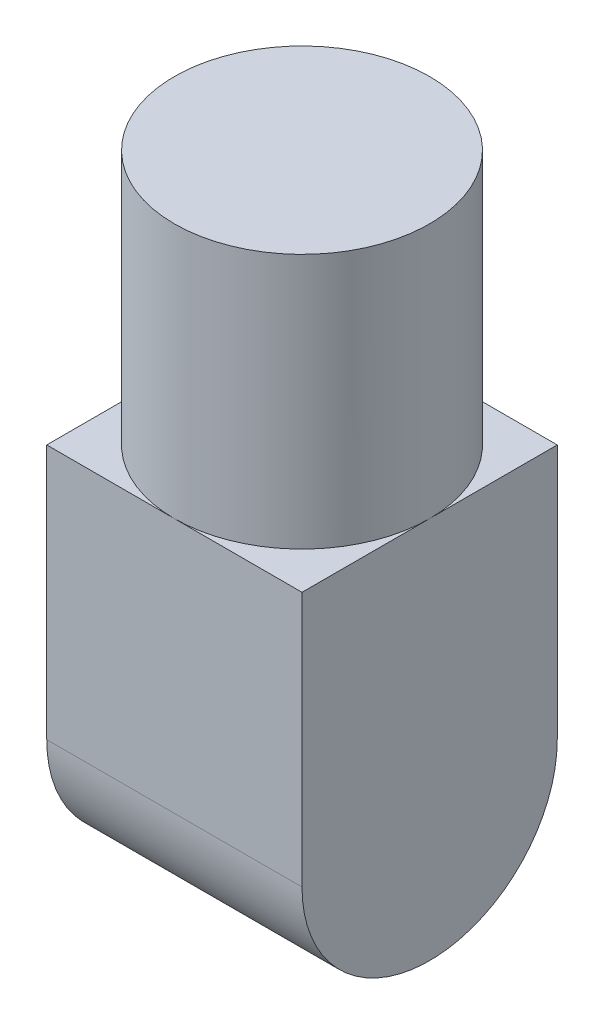
ISO-10303-21;
HEADER;
FILE_DESCRIPTION(('STEP AP214'),'2;1');
FILE_NAME('part.step','',(''),(''),'','','');
FILE_SCHEMA(('AUTOMOTIVE_DESIGN { 1 0 10303 214 1 1 1 1 }'));
ENDSEC;
DATA;
#1=APPLICATION_CONTEXT('core data for automotive mechanical design processes');
#2=APPLICATION_PROTOCOL_DEFINITION('international standard','automotive_design',2000,#1);
#3=PRODUCT_CONTEXT('',#1,'mechanical');
#4=PRODUCT('Part','Part','',(#3));
#5=PRODUCT_RELATED_PRODUCT_CATEGORY('part','',(#4));
#6=PRODUCT_DEFINITION_FORMATION('','',#4);
#7=PRODUCT_DEFINITION_CONTEXT('part definition',#1,'design');
#8=PRODUCT_DEFINITION('design','',#6,#7);
#9=PRODUCT_DEFINITION_SHAPE('','',#8);
#10=(LENGTH_UNIT() NAMED_UNIT(*) SI_UNIT(.MILLI.,.METRE.));
#11=(NAMED_UNIT(*) PLANE_ANGLE_UNIT() SI_UNIT($,.RADIAN.));
#12=(NAMED_UNIT(*) SI_UNIT($,.STERADIAN.) SOLID_ANGLE_UNIT());
#13=UNCERTAINTY_MEASURE_WITH_UNIT(LENGTH_MEASURE(1.E-05),#10,'distance_accuracy_value','');
#14=(GEOMETRIC_REPRESENTATION_CONTEXT(3) GLOBAL_UNCERTAINTY_ASSIGNED_CONTEXT((#13)) GLOBAL_UNIT_ASSIGNED_CONTEXT((#10,
#11,#12)) REPRESENTATION_CONTEXT('',''));
#15=CARTESIAN_POINT('',(0.,0.,0.));
#16=DIRECTION('',(0.,0.,1.));
#17=DIRECTION('',(1.,0.,0.));
#18=AXIS2_PLACEMENT_3D('',#15,#16,#17);
#19=CARTESIAN_POINT('',(80.,40.,40.));
#20=DIRECTION('',(0.,-1.,0.));
#21=DIRECTION('',(0.,0.,-1.));
#22=AXIS2_PLACEMENT_3D('',#19,#20,#21);
#23=PLANE('',#22);
#24=CARTESIAN_POINT('',(40.,40.,0.));
#25=DIRECTION('',(0.,1.,0.));
#26=DIRECTION('',(0.,0.,1.));
#27=AXIS2_PLACEMENT_3D('',#24,#25,#26);
#28=CIRCLE('',#27,40.);
#29=CARTESIAN_POINT('',(40.,40.,40.));
#30=VERTEX_POINT('',#29);
#31=CARTESIAN_POINT('',(80.,40.,0.));
#32=VERTEX_POINT('',#31);
#33=EDGE_CURVE('E48',#30,#32,#28,.T.);
#34=ORIENTED_EDGE('',*,*,#33,.F.);
#35=DIRECTION('',(-1.,0.,0.));
#36=VECTOR('',#35,1.);
#37=CARTESIAN_POINT('',(80.,40.,40.));
#38=LINE('',#37,#36);
#39=CARTESIAN_POINT('',(80.,40.,40.));
#40=VERTEX_POINT('',#39);
#41=EDGE_CURVE('E92',#40,#30,#38,.T.);
#42=ORIENTED_EDGE('',*,*,#41,.F.);
#43=DIRECTION('',(0.,0.,1.));
#44=VECTOR('',#43,1.);
#45=CARTESIAN_POINT('',(80.,40.,40.));
#46=LINE('',#45,#44);
#47=EDGE_CURVE('E111',#32,#40,#46,.T.);
#48=ORIENTED_EDGE('',*,*,#47,.F.);
#49=EDGE_LOOP('',(#34,#42,#48));
#50=FACE_BOUND('',#49,.T.);
#51=ADVANCED_FACE('F37',(#50),#23,.F.);
#52=CARTESIAN_POINT('',(40.,40.,-40.));
#53=VERTEX_POINT('',#52);
#54=EDGE_CURVE('E11',#32,#53,#28,.T.);
#55=ORIENTED_EDGE('',*,*,#54,.F.);
#56=CARTESIAN_POINT('',(80.,40.,-40.));
#57=VERTEX_POINT('',#56);
#58=EDGE_CURVE('E122',#57,#32,#46,.T.);
#59=ORIENTED_EDGE('',*,*,#58,.F.);
#60=DIRECTION('',(-1.,0.,0.));
#61=VECTOR('',#60,1.);
#62=CARTESIAN_POINT('',(80.,40.,-40.));
#63=LINE('',#62,#61);
#64=EDGE_CURVE('E41',#57,#53,#63,.T.);
#65=ORIENTED_EDGE('',*,*,#64,.T.);
#66=EDGE_LOOP('',(#55,#59,#65));
#67=FACE_BOUND('',#66,.T.);
#68=ADVANCED_FACE('F153',(#67),#23,.F.);
#69=CARTESIAN_POINT('',(0.,40.,0.));
#70=VERTEX_POINT('',#69);
#71=EDGE_CURVE('E46',#53,#70,#28,.T.);
#72=ORIENTED_EDGE('',*,*,#71,.F.);
#73=CARTESIAN_POINT('',(0.,40.,-40.));
#74=VERTEX_POINT('',#73);
#75=EDGE_CURVE('E101',#53,#74,#63,.T.);
#76=ORIENTED_EDGE('',*,*,#75,.T.);
#77=DIRECTION('',(0.,0.,1.));
#78=VECTOR('',#77,1.);
#79=CARTESIAN_POINT('',(0.,40.,40.));
#80=LINE('',#79,#78);
#81=EDGE_CURVE('E131',#74,#70,#80,.T.);
#82=ORIENTED_EDGE('',*,*,#81,.T.);
#83=EDGE_LOOP('',(#72,#76,#82));
#84=FACE_BOUND('',#83,.T.);
#85=ADVANCED_FACE('F155',(#84),#23,.F.);
#86=CARTESIAN_POINT('',(80.,-40.,-40.));
#87=DIRECTION('',(0.,0.,1.));
#88=DIRECTION('',(1.,0.,0.));
#89=AXIS2_PLACEMENT_3D('',#86,#87,#88);
#90=PLANE('',#89);
#91=DIRECTION('',(0.,1.,0.));
#92=VECTOR('',#91,1.);
#93=CARTESIAN_POINT('',(0.,-40.,-40.));
#94=LINE('',#93,#92);
#95=CARTESIAN_POINT('',(0.,-40.,-40.));
#96=VERTEX_POINT('',#95);
#97=EDGE_CURVE('E128',#96,#74,#94,.T.);
#98=ORIENTED_EDGE('',*,*,#97,.T.);
#99=ORIENTED_EDGE('',*,*,#75,.F.);
#100=ORIENTED_EDGE('',*,*,#64,.F.);
#101=DIRECTION('',(0.,1.,0.));
#102=VECTOR('',#101,1.);
#103=CARTESIAN_POINT('',(80.,-40.,-40.));
#104=LINE('',#103,#102);
#105=CARTESIAN_POINT('',(80.,-40.,-40.));
#106=VERTEX_POINT('',#105);
#107=EDGE_CURVE('E118',#106,#57,#104,.T.);
#108=ORIENTED_EDGE('',*,*,#107,.F.);
#109=DIRECTION('',(-1.,0.,0.));
#110=VECTOR('',#109,1.);
#111=CARTESIAN_POINT('',(80.,-40.,-40.));
#112=LINE('',#111,#110);
#113=EDGE_CURVE('E127',#106,#96,#112,.T.);
#114=ORIENTED_EDGE('',*,*,#113,.T.);
#115=EDGE_LOOP('',(#98,#99,#100,#108,#114));
#116=FACE_BOUND('',#115,.T.);
#117=ADVANCED_FACE('F39',(#116),#90,.F.);
#118=EDGE_CURVE('E105',#70,#30,#28,.T.);
#119=ORIENTED_EDGE('',*,*,#118,.F.);
#120=CARTESIAN_POINT('',(0.,40.,40.));
#121=VERTEX_POINT('',#120);
#122=EDGE_CURVE('E107',#70,#121,#80,.T.);
#123=ORIENTED_EDGE('',*,*,#122,.T.);
#124=EDGE_CURVE('E95',#30,#121,#38,.T.);
#125=ORIENTED_EDGE('',*,*,#124,.F.);
#126=EDGE_LOOP('',(#119,#123,#125));
#127=FACE_BOUND('',#126,.T.);
#128=ADVANCED_FACE('F103',(#127),#23,.F.);
#129=CARTESIAN_POINT('',(80.,-40.,40.));
#130=DIRECTION('',(0.,0.,-1.));
#131=DIRECTION('',(-1.,0.,0.));
#132=AXIS2_PLACEMENT_3D('',#129,#130,#131);
#133=PLANE('',#132);
#134=DIRECTION('',(0.,-1.,0.));
#135=VECTOR('',#134,1.);
#136=CARTESIAN_POINT('',(0.,-40.,40.));
#137=LINE('',#136,#135);
#138=CARTESIAN_POINT('',(0.,-40.,40.));
#139=VERTEX_POINT('',#138);
#140=EDGE_CURVE('E133',#121,#139,#137,.T.);
#141=ORIENTED_EDGE('',*,*,#140,.T.);
#142=DIRECTION('',(-1.,0.,0.));
#143=VECTOR('',#142,1.);
#144=CARTESIAN_POINT('',(80.,-40.,40.));
#145=LINE('',#144,#143);
#146=CARTESIAN_POINT('',(80.,-40.,40.));
#147=VERTEX_POINT('',#146);
#148=EDGE_CURVE('E109',#147,#139,#145,.T.);
#149=ORIENTED_EDGE('',*,*,#148,.F.);
#150=DIRECTION('',(0.,-1.,0.));
#151=VECTOR('',#150,1.);
#152=CARTESIAN_POINT('',(80.,-40.,40.));
#153=LINE('',#152,#151);
#154=EDGE_CURVE('E98',#40,#147,#153,.T.);
#155=ORIENTED_EDGE('',*,*,#154,.F.);
#156=ORIENTED_EDGE('',*,*,#41,.T.);
#157=ORIENTED_EDGE('',*,*,#124,.T.);
#158=EDGE_LOOP('',(#141,#149,#155,#156,#157));
#159=FACE_BOUND('',#158,.T.);
#160=ADVANCED_FACE('F94',(#159),#133,.F.);
#161=CARTESIAN_POINT('',(80.,-40.,0.));
#162=DIRECTION('',(-1.,0.,0.));
#163=DIRECTION('',(0.,0.,1.));
#164=AXIS2_PLACEMENT_3D('',#161,#162,#163);
#165=CYLINDRICAL_SURFACE('',#164,40.);
#166=CARTESIAN_POINT('',(0.,-40.,0.));
#167=DIRECTION('',(1.,0.,0.));
#168=DIRECTION('',(0.,0.,-1.));
#169=AXIS2_PLACEMENT_3D('',#166,#167,#168);
#170=CIRCLE('',#169,40.);
#171=EDGE_CURVE('E121',#139,#96,#170,.T.);
#172=ORIENTED_EDGE('',*,*,#171,.T.);
#173=ORIENTED_EDGE('',*,*,#113,.F.);
#174=CARTESIAN_POINT('',(80.,-40.,0.));
#175=DIRECTION('',(1.,0.,0.));
#176=DIRECTION('',(0.,0.,-1.));
#177=AXIS2_PLACEMENT_3D('',#174,#175,#176);
#178=CIRCLE('',#177,40.);
#179=EDGE_CURVE('E125',#147,#106,#178,.T.);
#180=ORIENTED_EDGE('',*,*,#179,.F.);
#181=ORIENTED_EDGE('',*,*,#148,.T.);
#182=EDGE_LOOP('',(#172,#173,#180,#181));
#183=FACE_BOUND('',#182,.T.);
#184=ADVANCED_FACE('F142',(#183),#165,.T.);
#185=CARTESIAN_POINT('',(80.,-40.,0.));
#186=DIRECTION('',(1.,0.,0.));
#187=DIRECTION('',(0.,0.,-1.));
#188=AXIS2_PLACEMENT_3D('',#185,#186,#187);
#189=PLANE('',#188);
#190=ORIENTED_EDGE('',*,*,#107,.T.);
#191=ORIENTED_EDGE('',*,*,#58,.T.);
#192=ORIENTED_EDGE('',*,*,#47,.T.);
#193=ORIENTED_EDGE('',*,*,#154,.T.);
#194=ORIENTED_EDGE('',*,*,#179,.T.);
#195=EDGE_LOOP('',(#190,#191,#192,#193,#194));
#196=FACE_BOUND('',#195,.T.);
#197=ADVANCED_FACE('F152',(#196),#189,.T.);
#198=CARTESIAN_POINT('',(0.,-40.,0.));
#199=DIRECTION('',(1.,0.,0.));
#200=DIRECTION('',(0.,0.,-1.));
#201=AXIS2_PLACEMENT_3D('',#198,#199,#200);
#202=PLANE('',#201);
#203=ORIENTED_EDGE('',*,*,#97,.F.);
#204=ORIENTED_EDGE('',*,*,#171,.F.);
#205=ORIENTED_EDGE('',*,*,#140,.F.);
#206=ORIENTED_EDGE('',*,*,#122,.F.);
#207=ORIENTED_EDGE('',*,*,#81,.F.);
#208=EDGE_LOOP('',(#203,#204,#205,#206,#207));
#209=FACE_BOUND('',#208,.T.);
#210=ADVANCED_FACE('F146',(#209),#202,.F.);
#211=CARTESIAN_POINT('',(40.,120.,0.));
#212=DIRECTION('',(0.,-1.,0.));
#213=DIRECTION('',(0.,0.,-1.));
#214=AXIS2_PLACEMENT_3D('',#211,#212,#213);
#215=CYLINDRICAL_SURFACE('',#214,40.);
#216=CARTESIAN_POINT('',(40.,120.,0.));
#217=DIRECTION('',(0.,1.,0.));
#218=DIRECTION('',(0.,0.,1.));
#219=AXIS2_PLACEMENT_3D('',#216,#217,#218);
#220=CIRCLE('',#219,40.);
#221=CARTESIAN_POINT('',(40.,120.,40.));
#222=VERTEX_POINT('',#221);
#223=EDGE_CURVE('E114',#222,#222,#220,.T.);
#224=ORIENTED_EDGE('',*,*,#223,.F.);
#225=EDGE_LOOP('',(#224));
#226=FACE_BOUND('',#225,.T.);
#227=ORIENTED_EDGE('',*,*,#33,.T.);
#228=ORIENTED_EDGE('',*,*,#54,.T.);
#229=ORIENTED_EDGE('',*,*,#71,.T.);
#230=ORIENTED_EDGE('',*,*,#118,.T.);
#231=EDGE_LOOP('',(#227,#228,#229,#230));
#232=FACE_BOUND('',#231,.T.);
#233=ADVANCED_FACE('F115',(#226,#232),#215,.T.);
#234=CARTESIAN_POINT('',(40.,120.,0.));
#235=DIRECTION('',(0.,1.,0.));
#236=DIRECTION('',(0.,0.,1.));
#237=AXIS2_PLACEMENT_3D('',#234,#235,#236);
#238=PLANE('',#237);
#239=ORIENTED_EDGE('',*,*,#223,.T.);
#240=EDGE_LOOP('',(#239));
#241=FACE_BOUND('',#240,.T.);
#242=ADVANCED_FACE('F172',(#241),#238,.T.);
#243=CLOSED_SHELL('',(#51,#68,#85,#117,#128,#160,#184,#197,#210,#233,#242));
#244=MANIFOLD_SOLID_BREP('B2',#243);
#245=ADVANCED_BREP_SHAPE_REPRESENTATION('',(#18,#244),#14);
#246=SHAPE_DEFINITION_REPRESENTATION(#9,#245);
ENDSEC;
END-ISO-10303-21;
